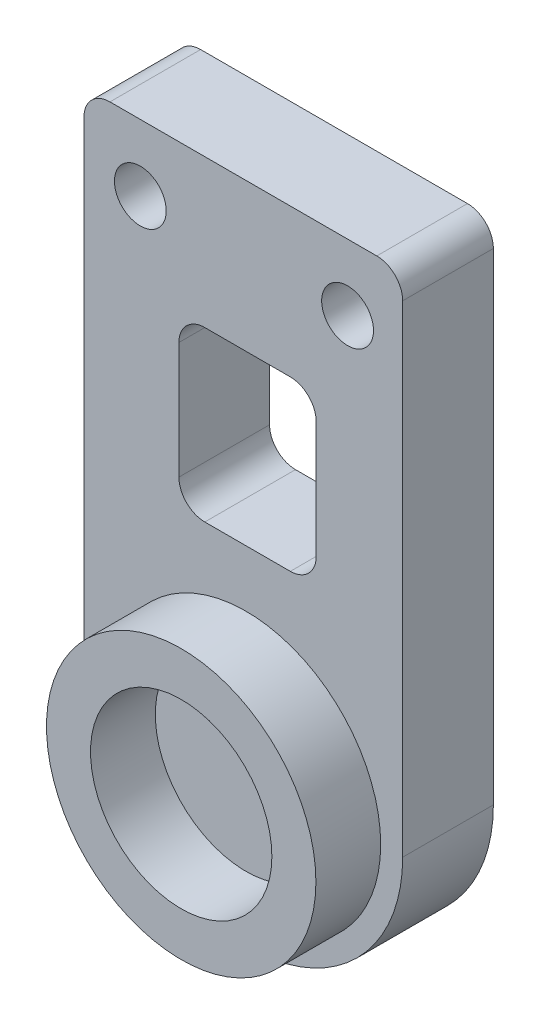
ISO-10303-21;
HEADER;
FILE_DESCRIPTION(('STEP AP214'),'2;1');
FILE_NAME('part.step','',(''),(''),'','','');
FILE_SCHEMA(('AUTOMOTIVE_DESIGN { 1 0 10303 214 1 1 1 1 }'));
ENDSEC;
DATA;
#1=APPLICATION_CONTEXT('core data for automotive mechanical design processes');
#2=APPLICATION_PROTOCOL_DEFINITION('international standard','automotive_design',2000,#1);
#3=PRODUCT_CONTEXT('',#1,'mechanical');
#4=PRODUCT('Part','Part','',(#3));
#5=PRODUCT_RELATED_PRODUCT_CATEGORY('part','',(#4));
#6=PRODUCT_DEFINITION_FORMATION('','',#4);
#7=PRODUCT_DEFINITION_CONTEXT('part definition',#1,'design');
#8=PRODUCT_DEFINITION('design','',#6,#7);
#9=PRODUCT_DEFINITION_SHAPE('','',#8);
#10=(LENGTH_UNIT() NAMED_UNIT(*) SI_UNIT(.MILLI.,.METRE.));
#11=(NAMED_UNIT(*) PLANE_ANGLE_UNIT() SI_UNIT($,.RADIAN.));
#12=(NAMED_UNIT(*) SI_UNIT($,.STERADIAN.) SOLID_ANGLE_UNIT());
#13=UNCERTAINTY_MEASURE_WITH_UNIT(LENGTH_MEASURE(1.E-05),#10,'distance_accuracy_value','');
#14=(GEOMETRIC_REPRESENTATION_CONTEXT(3) GLOBAL_UNCERTAINTY_ASSIGNED_CONTEXT((#13)) GLOBAL_UNIT_ASSIGNED_CONTEXT((#10,
#11,#12)) REPRESENTATION_CONTEXT('',''));
#15=CARTESIAN_POINT('',(0.,0.,0.));
#16=DIRECTION('',(0.,0.,1.));
#17=DIRECTION('',(1.,0.,0.));
#18=AXIS2_PLACEMENT_3D('',#15,#16,#17);
#19=CARTESIAN_POINT('',(-301.254618969033,240.505749953129,11.5));
#20=DIRECTION('',(1.,0.,0.));
#21=DIRECTION('',(0.,0.,-1.));
#22=AXIS2_PLACEMENT_3D('',#19,#20,#21);
#23=PLANE('',#22);
#24=DIRECTION('',(0.,-1.,0.));
#25=VECTOR('',#24,1.);
#26=CARTESIAN_POINT('',(-301.254618969033,240.505749953129,8.));
#27=LINE('',#26,#25);
#28=CARTESIAN_POINT('',(-301.254618969033,239.505749953129,8.));
#29=VERTEX_POINT('',#28);
#30=CARTESIAN_POINT('',(-301.254618969033,220.905749953129,8.));
#31=VERTEX_POINT('',#30);
#32=EDGE_CURVE('E201',#29,#31,#27,.T.);
#33=ORIENTED_EDGE('',*,*,#32,.T.);
#34=DIRECTION('',(0.,0.,-1.));
#35=VECTOR('',#34,1.);
#36=CARTESIAN_POINT('',(-301.254618969033,220.905749953129,11.5));
#37=LINE('',#36,#35);
#38=CARTESIAN_POINT('',(-301.254618969033,220.905749953129,11.5));
#39=VERTEX_POINT('',#38);
#40=EDGE_CURVE('E44',#31,#39,#37,.F.);
#41=ORIENTED_EDGE('',*,*,#40,.T.);
#42=DIRECTION('',(0.,-1.,0.));
#43=VECTOR('',#42,1.);
#44=CARTESIAN_POINT('',(-301.254618969033,240.505749953129,11.5));
#45=LINE('',#44,#43);
#46=CARTESIAN_POINT('',(-301.254618969033,239.505749953129,11.5));
#47=VERTEX_POINT('',#46);
#48=EDGE_CURVE('E191',#47,#39,#45,.T.);
#49=ORIENTED_EDGE('',*,*,#48,.F.);
#50=DIRECTION('',(0.,0.,-1.));
#51=VECTOR('',#50,1.);
#52=CARTESIAN_POINT('',(-301.254618969033,239.505749953129,11.5));
#53=LINE('',#52,#51);
#54=EDGE_CURVE('E224',#47,#29,#53,.T.);
#55=ORIENTED_EDGE('',*,*,#54,.T.);
#56=EDGE_LOOP('',(#33,#41,#49,#55));
#57=FACE_BOUND('',#56,.T.);
#58=ADVANCED_FACE('F36',(#57),#23,.F.);
#59=CARTESIAN_POINT('',(-301.254618969033,214.905749953129,11.5));
#60=DIRECTION('',(0.,1.,0.));
#61=DIRECTION('',(0.,0.,1.));
#62=AXIS2_PLACEMENT_3D('',#59,#60,#61);
#63=PLANE('',#62);
#64=DIRECTION('',(1.,0.,0.));
#65=VECTOR('',#64,1.);
#66=CARTESIAN_POINT('',(-301.254618969033,214.905749953129,8.));
#67=LINE('',#66,#65);
#68=CARTESIAN_POINT('',(-295.254618969033,214.905749953129,8.));
#69=VERTEX_POINT('',#68);
#70=CARTESIAN_POINT('',(-294.954618969033,214.905749953129,8.));
#71=VERTEX_POINT('',#70);
#72=EDGE_CURVE('E203',#69,#71,#67,.T.);
#73=ORIENTED_EDGE('',*,*,#72,.T.);
#74=DIRECTION('',(0.,0.,-1.));
#75=VECTOR('',#74,1.);
#76=CARTESIAN_POINT('',(-294.954618969033,214.905749953129,11.5));
#77=LINE('',#76,#75);
#78=CARTESIAN_POINT('',(-294.954618969033,214.905749953129,11.5));
#79=VERTEX_POINT('',#78);
#80=EDGE_CURVE('E58',#71,#79,#77,.F.);
#81=ORIENTED_EDGE('',*,*,#80,.T.);
#82=DIRECTION('',(1.,0.,0.));
#83=VECTOR('',#82,1.);
#84=CARTESIAN_POINT('',(-301.254618969033,214.905749953129,11.5));
#85=LINE('',#84,#83);
#86=CARTESIAN_POINT('',(-295.254618969033,214.905749953129,11.5));
#87=VERTEX_POINT('',#86);
#88=EDGE_CURVE('E193',#87,#79,#85,.T.);
#89=ORIENTED_EDGE('',*,*,#88,.F.);
#90=DIRECTION('',(0.,0.,-1.));
#91=VECTOR('',#90,1.);
#92=CARTESIAN_POINT('',(-295.254618969033,214.905749953129,11.5));
#93=LINE('',#92,#91);
#94=EDGE_CURVE('E262',#87,#69,#93,.T.);
#95=ORIENTED_EDGE('',*,*,#94,.T.);
#96=EDGE_LOOP('',(#73,#81,#89,#95));
#97=FACE_BOUND('',#96,.T.);
#98=ADVANCED_FACE('F282',(#97),#63,.F.);
#99=CARTESIAN_POINT('',(-288.954618969033,240.505749953129,11.5));
#100=DIRECTION('',(-1.,0.,0.));
#101=DIRECTION('',(0.,-1.,0.));
#102=AXIS2_PLACEMENT_3D('',#99,#100,#101);
#103=PLANE('',#102);
#104=DIRECTION('',(0.,1.,0.));
#105=VECTOR('',#104,1.);
#106=CARTESIAN_POINT('',(-288.954618969033,240.505749953129,11.5));
#107=LINE('',#106,#105);
#108=CARTESIAN_POINT('',(-288.954618969033,220.905749953129,11.5));
#109=VERTEX_POINT('',#108);
#110=CARTESIAN_POINT('',(-288.954618969033,239.505749953129,11.5));
#111=VERTEX_POINT('',#110);
#112=EDGE_CURVE('E196',#109,#111,#107,.T.);
#113=ORIENTED_EDGE('',*,*,#112,.F.);
#114=DIRECTION('',(0.,0.,-1.));
#115=VECTOR('',#114,1.);
#116=CARTESIAN_POINT('',(-288.954618969033,220.905749953129,11.5));
#117=LINE('',#116,#115);
#118=CARTESIAN_POINT('',(-288.954618969033,220.905749953129,8.));
#119=VERTEX_POINT('',#118);
#120=EDGE_CURVE('E255',#109,#119,#117,.T.);
#121=ORIENTED_EDGE('',*,*,#120,.T.);
#122=DIRECTION('',(0.,1.,0.));
#123=VECTOR('',#122,1.);
#124=CARTESIAN_POINT('',(-288.954618969033,240.505749953129,8.));
#125=LINE('',#124,#123);
#126=CARTESIAN_POINT('',(-288.954618969033,239.505749953129,8.));
#127=VERTEX_POINT('',#126);
#128=EDGE_CURVE('E206',#119,#127,#125,.T.);
#129=ORIENTED_EDGE('',*,*,#128,.T.);
#130=DIRECTION('',(0.,0.,-1.));
#131=VECTOR('',#130,1.);
#132=CARTESIAN_POINT('',(-288.954618969033,239.505749953129,11.5));
#133=LINE('',#132,#131);
#134=EDGE_CURVE('E163',#127,#111,#133,.F.);
#135=ORIENTED_EDGE('',*,*,#134,.T.);
#136=EDGE_LOOP('',(#113,#121,#129,#135));
#137=FACE_BOUND('',#136,.T.);
#138=ADVANCED_FACE('F274',(#137),#103,.F.);
#139=CARTESIAN_POINT('',(-301.254618969033,240.505749953129,11.5));
#140=DIRECTION('',(0.,-1.,0.));
#141=DIRECTION('',(0.,0.,-1.));
#142=AXIS2_PLACEMENT_3D('',#139,#140,#141);
#143=PLANE('',#142);
#144=DIRECTION('',(-1.,0.,0.));
#145=VECTOR('',#144,1.);
#146=CARTESIAN_POINT('',(-301.254618969033,240.505749953129,8.));
#147=LINE('',#146,#145);
#148=CARTESIAN_POINT('',(-289.954618969033,240.505749953129,8.));
#149=VERTEX_POINT('',#148);
#150=CARTESIAN_POINT('',(-300.254618969033,240.505749953129,8.));
#151=VERTEX_POINT('',#150);
#152=EDGE_CURVE('E194',#149,#151,#147,.T.);
#153=ORIENTED_EDGE('',*,*,#152,.T.);
#154=DIRECTION('',(0.,0.,-1.));
#155=VECTOR('',#154,1.);
#156=CARTESIAN_POINT('',(-300.254618969033,240.505749953129,11.5));
#157=LINE('',#156,#155);
#158=CARTESIAN_POINT('',(-300.254618969033,240.505749953129,11.5));
#159=VERTEX_POINT('',#158);
#160=EDGE_CURVE('E235',#151,#159,#157,.F.);
#161=ORIENTED_EDGE('',*,*,#160,.T.);
#162=DIRECTION('',(-1.,0.,0.));
#163=VECTOR('',#162,1.);
#164=CARTESIAN_POINT('',(-301.254618969033,240.505749953129,11.5));
#165=LINE('',#164,#163);
#166=CARTESIAN_POINT('',(-289.954618969033,240.505749953129,11.5));
#167=VERTEX_POINT('',#166);
#168=EDGE_CURVE('E198',#167,#159,#165,.T.);
#169=ORIENTED_EDGE('',*,*,#168,.F.);
#170=DIRECTION('',(0.,0.,-1.));
#171=VECTOR('',#170,1.);
#172=CARTESIAN_POINT('',(-289.954618969033,240.505749953129,11.5));
#173=LINE('',#172,#171);
#174=EDGE_CURVE('E232',#167,#149,#173,.T.);
#175=ORIENTED_EDGE('',*,*,#174,.T.);
#176=EDGE_LOOP('',(#153,#161,#169,#175));
#177=FACE_BOUND('',#176,.T.);
#178=ADVANCED_FACE('F294',(#177),#143,.F.);
#179=CARTESIAN_POINT('',(0.,0.,11.5));
#180=DIRECTION('',(0.,0.,1.));
#181=DIRECTION('',(1.,0.,0.));
#182=AXIS2_PLACEMENT_3D('',#179,#180,#181);
#183=PLANE('',#182);
#184=CARTESIAN_POINT('',(-295.004474020561,220.905749953129,11.5));
#185=DIRECTION('',(0.,0.,1.));
#186=DIRECTION('',(1.,0.,0.));
#187=AXIS2_PLACEMENT_3D('',#184,#185,#186);
#188=CIRCLE('',#187,5.19999999999997);
#189=CARTESIAN_POINT('',(-289.804474020561,220.905749953129,11.5));
#190=VERTEX_POINT('',#189);
#191=EDGE_CURVE('E353',#190,#190,#188,.T.);
#192=ORIENTED_EDGE('',*,*,#191,.F.);
#193=EDGE_LOOP('',(#192));
#194=FACE_BOUND('',#193,.T.);
#195=CARTESIAN_POINT('',(-299.082028178935,237.944260963885,11.5));
#196=DIRECTION('',(0.,0.,1.));
#197=DIRECTION('',(1.,0.,0.));
#198=AXIS2_PLACEMENT_3D('',#195,#196,#197);
#199=CIRCLE('',#198,0.999999999999998);
#200=CARTESIAN_POINT('',(-298.082028178935,237.944260963885,11.5));
#201=VERTEX_POINT('',#200);
#202=EDGE_CURVE('E364',#201,#201,#199,.T.);
#203=ORIENTED_EDGE('',*,*,#202,.F.);
#204=EDGE_LOOP('',(#203));
#205=FACE_BOUND('',#204,.T.);
#206=CARTESIAN_POINT('',(-291.082028178935,237.944260963885,11.5));
#207=DIRECTION('',(0.,0.,1.));
#208=DIRECTION('',(1.,0.,0.));
#209=AXIS2_PLACEMENT_3D('',#206,#207,#208);
#210=CIRCLE('',#209,0.999999999999998);
#211=CARTESIAN_POINT('',(-290.082028178935,237.944260963885,11.5));
#212=VERTEX_POINT('',#211);
#213=EDGE_CURVE('E340',#212,#212,#210,.T.);
#214=ORIENTED_EDGE('',*,*,#213,.F.);
#215=EDGE_LOOP('',(#214));
#216=FACE_BOUND('',#215,.T.);
#217=DIRECTION('',(0.,-1.,0.));
#218=VECTOR('',#217,1.);
#219=CARTESIAN_POINT('',(-297.592907714844,234.792892456055,11.5));
#220=LINE('',#219,#218);
#221=CARTESIAN_POINT('',(-297.592907714844,233.792892456055,11.5));
#222=VERTEX_POINT('',#221);
#223=CARTESIAN_POINT('',(-297.592907714844,229.292892456055,11.5));
#224=VERTEX_POINT('',#223);
#225=EDGE_CURVE('E187',#222,#224,#220,.T.);
#226=ORIENTED_EDGE('',*,*,#225,.F.);
#227=CARTESIAN_POINT('',(-296.592907714844,233.792892456055,11.5));
#228=DIRECTION('',(0.,0.,1.));
#229=DIRECTION('',(1.,0.,0.));
#230=AXIS2_PLACEMENT_3D('',#227,#228,#229);
#231=CIRCLE('',#230,1.);
#232=CARTESIAN_POINT('',(-296.592907714844,234.792892456055,11.5));
#233=VERTEX_POINT('',#232);
#234=EDGE_CURVE('E248',#222,#233,#231,.F.);
#235=ORIENTED_EDGE('',*,*,#234,.T.);
#236=DIRECTION('',(-1.,0.,0.));
#237=VECTOR('',#236,1.);
#238=CARTESIAN_POINT('',(-297.592907714844,234.792892456055,11.5));
#239=LINE('',#238,#237);
#240=CARTESIAN_POINT('',(-293.292907714844,234.792892456055,11.5));
#241=VERTEX_POINT('',#240);
#242=EDGE_CURVE('E181',#241,#233,#239,.T.);
#243=ORIENTED_EDGE('',*,*,#242,.F.);
#244=CARTESIAN_POINT('',(-293.292907714844,233.792892456055,11.5));
#245=DIRECTION('',(0.,0.,1.));
#246=DIRECTION('',(1.,0.,0.));
#247=AXIS2_PLACEMENT_3D('',#244,#245,#246);
#248=CIRCLE('',#247,1.);
#249=CARTESIAN_POINT('',(-292.292907714844,233.792892456055,11.5));
#250=VERTEX_POINT('',#249);
#251=EDGE_CURVE('E180',#241,#250,#248,.F.);
#252=ORIENTED_EDGE('',*,*,#251,.T.);
#253=DIRECTION('',(0.,1.,0.));
#254=VECTOR('',#253,1.);
#255=CARTESIAN_POINT('',(-292.292907714844,234.792892456055,11.5));
#256=LINE('',#255,#254);
#257=CARTESIAN_POINT('',(-292.292907714844,229.292892456055,11.5));
#258=VERTEX_POINT('',#257);
#259=EDGE_CURVE('E169',#258,#250,#256,.T.);
#260=ORIENTED_EDGE('',*,*,#259,.F.);
#261=CARTESIAN_POINT('',(-293.292907714844,229.292892456055,11.5));
#262=DIRECTION('',(0.,0.,1.));
#263=DIRECTION('',(1.,0.,0.));
#264=AXIS2_PLACEMENT_3D('',#261,#262,#263);
#265=CIRCLE('',#264,1.);
#266=CARTESIAN_POINT('',(-293.292907714844,228.292892456055,11.5));
#267=VERTEX_POINT('',#266);
#268=EDGE_CURVE('E152',#258,#267,#265,.F.);
#269=ORIENTED_EDGE('',*,*,#268,.T.);
#270=DIRECTION('',(1.,0.,0.));
#271=VECTOR('',#270,1.);
#272=CARTESIAN_POINT('',(-297.592907714844,228.292892456055,11.5));
#273=LINE('',#272,#271);
#274=CARTESIAN_POINT('',(-296.592907714844,228.292892456055,11.5));
#275=VERTEX_POINT('',#274);
#276=EDGE_CURVE('E182',#275,#267,#273,.T.);
#277=ORIENTED_EDGE('',*,*,#276,.F.);
#278=CARTESIAN_POINT('',(-296.592907714844,229.292892456055,11.5));
#279=DIRECTION('',(0.,0.,1.));
#280=DIRECTION('',(1.,0.,0.));
#281=AXIS2_PLACEMENT_3D('',#278,#279,#280);
#282=CIRCLE('',#281,1.);
#283=EDGE_CURVE('E244',#275,#224,#282,.F.);
#284=ORIENTED_EDGE('',*,*,#283,.T.);
#285=EDGE_LOOP('',(#226,#235,#243,#252,#260,#269,#277,#284));
#286=FACE_BOUND('',#285,.T.);
#287=ORIENTED_EDGE('',*,*,#88,.T.);
#288=CARTESIAN_POINT('',(-294.954618969033,220.905749953129,11.5));
#289=DIRECTION('',(0.,0.,1.));
#290=DIRECTION('',(1.,0.,0.));
#291=AXIS2_PLACEMENT_3D('',#288,#289,#290);
#292=CIRCLE('',#291,6.);
#293=EDGE_CURVE('E268',#79,#109,#292,.T.);
#294=ORIENTED_EDGE('',*,*,#293,.T.);
#295=ORIENTED_EDGE('',*,*,#112,.T.);
#296=CARTESIAN_POINT('',(-289.954618969033,239.505749953129,11.5));
#297=DIRECTION('',(0.,0.,1.));
#298=DIRECTION('',(1.,0.,0.));
#299=AXIS2_PLACEMENT_3D('',#296,#297,#298);
#300=CIRCLE('',#299,1.);
#301=EDGE_CURVE('E237',#111,#167,#300,.T.);
#302=ORIENTED_EDGE('',*,*,#301,.T.);
#303=ORIENTED_EDGE('',*,*,#168,.T.);
#304=CARTESIAN_POINT('',(-300.254618969033,239.505749953129,11.5));
#305=DIRECTION('',(0.,0.,1.));
#306=DIRECTION('',(1.,0.,0.));
#307=AXIS2_PLACEMENT_3D('',#304,#305,#306);
#308=CIRCLE('',#307,1.);
#309=EDGE_CURVE('E239',#159,#47,#308,.T.);
#310=ORIENTED_EDGE('',*,*,#309,.T.);
#311=ORIENTED_EDGE('',*,*,#48,.T.);
#312=CARTESIAN_POINT('',(-295.254618969033,220.905749953129,11.5));
#313=DIRECTION('',(0.,0.,1.));
#314=DIRECTION('',(1.,0.,0.));
#315=AXIS2_PLACEMENT_3D('',#312,#313,#314);
#316=CIRCLE('',#315,6.);
#317=EDGE_CURVE('E266',#39,#87,#316,.T.);
#318=ORIENTED_EDGE('',*,*,#317,.T.);
#319=EDGE_LOOP('',(#287,#294,#295,#302,#303,#310,#311,#318));
#320=FACE_BOUND('',#319,.T.);
#321=ADVANCED_FACE('F177',(#194,#205,#216,#286,#320),#183,.T.);
#322=CARTESIAN_POINT('',(0.,0.,8.));
#323=DIRECTION('',(0.,0.,1.));
#324=DIRECTION('',(1.,0.,0.));
#325=AXIS2_PLACEMENT_3D('',#322,#323,#324);
#326=PLANE('',#325);
#327=CARTESIAN_POINT('',(-299.082028178935,237.944260963885,8.));
#328=DIRECTION('',(0.,0.,1.));
#329=DIRECTION('',(1.,0.,0.));
#330=AXIS2_PLACEMENT_3D('',#327,#328,#329);
#331=CIRCLE('',#330,0.999999999999998);
#332=CARTESIAN_POINT('',(-298.082028178935,237.944260963885,8.));
#333=VERTEX_POINT('',#332);
#334=EDGE_CURVE('E204',#333,#333,#331,.T.);
#335=ORIENTED_EDGE('',*,*,#334,.T.);
#336=EDGE_LOOP('',(#335));
#337=FACE_BOUND('',#336,.T.);
#338=CARTESIAN_POINT('',(-291.082028178935,237.944260963885,8.));
#339=DIRECTION('',(0.,0.,1.));
#340=DIRECTION('',(1.,0.,0.));
#341=AXIS2_PLACEMENT_3D('',#338,#339,#340);
#342=CIRCLE('',#341,0.999999999999998);
#343=CARTESIAN_POINT('',(-290.082028178935,237.944260963885,8.));
#344=VERTEX_POINT('',#343);
#345=EDGE_CURVE('E343',#344,#344,#342,.T.);
#346=ORIENTED_EDGE('',*,*,#345,.T.);
#347=EDGE_LOOP('',(#346));
#348=FACE_BOUND('',#347,.T.);
#349=DIRECTION('',(0.,1.,0.));
#350=VECTOR('',#349,1.);
#351=CARTESIAN_POINT('',(-292.292907714844,234.792892456055,8.));
#352=LINE('',#351,#350);
#353=CARTESIAN_POINT('',(-292.292907714844,229.292892456055,8.));
#354=VERTEX_POINT('',#353);
#355=CARTESIAN_POINT('',(-292.292907714844,233.792892456055,8.));
#356=VERTEX_POINT('',#355);
#357=EDGE_CURVE('E172',#354,#356,#352,.T.);
#358=ORIENTED_EDGE('',*,*,#357,.T.);
#359=CARTESIAN_POINT('',(-293.292907714844,233.792892456055,8.));
#360=DIRECTION('',(0.,0.,1.));
#361=DIRECTION('',(1.,0.,0.));
#362=AXIS2_PLACEMENT_3D('',#359,#360,#361);
#363=CIRCLE('',#362,1.);
#364=CARTESIAN_POINT('',(-293.292907714844,234.792892456055,8.));
#365=VERTEX_POINT('',#364);
#366=EDGE_CURVE('E253',#356,#365,#363,.T.);
#367=ORIENTED_EDGE('',*,*,#366,.T.);
#368=DIRECTION('',(-1.,0.,0.));
#369=VECTOR('',#368,1.);
#370=CARTESIAN_POINT('',(-297.592907714844,234.792892456055,8.));
#371=LINE('',#370,#369);
#372=CARTESIAN_POINT('',(-296.592907714844,234.792892456055,8.));
#373=VERTEX_POINT('',#372);
#374=EDGE_CURVE('E335',#365,#373,#371,.T.);
#375=ORIENTED_EDGE('',*,*,#374,.T.);
#376=CARTESIAN_POINT('',(-296.592907714844,233.792892456055,8.));
#377=DIRECTION('',(0.,0.,1.));
#378=DIRECTION('',(1.,0.,0.));
#379=AXIS2_PLACEMENT_3D('',#376,#377,#378);
#380=CIRCLE('',#379,1.);
#381=CARTESIAN_POINT('',(-297.592907714844,233.792892456055,8.));
#382=VERTEX_POINT('',#381);
#383=EDGE_CURVE('E250',#373,#382,#380,.T.);
#384=ORIENTED_EDGE('',*,*,#383,.T.);
#385=DIRECTION('',(0.,-1.,0.));
#386=VECTOR('',#385,1.);
#387=CARTESIAN_POINT('',(-297.592907714844,234.792892456055,8.));
#388=LINE('',#387,#386);
#389=CARTESIAN_POINT('',(-297.592907714844,229.292892456055,8.));
#390=VERTEX_POINT('',#389);
#391=EDGE_CURVE('E185',#382,#390,#388,.T.);
#392=ORIENTED_EDGE('',*,*,#391,.T.);
#393=CARTESIAN_POINT('',(-296.592907714844,229.292892456055,8.));
#394=DIRECTION('',(0.,0.,1.));
#395=DIRECTION('',(1.,0.,0.));
#396=AXIS2_PLACEMENT_3D('',#393,#394,#395);
#397=CIRCLE('',#396,1.);
#398=CARTESIAN_POINT('',(-296.592907714844,228.292892456055,8.));
#399=VERTEX_POINT('',#398);
#400=EDGE_CURVE('E246',#390,#399,#397,.T.);
#401=ORIENTED_EDGE('',*,*,#400,.T.);
#402=DIRECTION('',(1.,0.,0.));
#403=VECTOR('',#402,1.);
#404=CARTESIAN_POINT('',(-297.592907714844,228.292892456055,8.));
#405=LINE('',#404,#403);
#406=CARTESIAN_POINT('',(-293.292907714844,228.292892456055,8.));
#407=VERTEX_POINT('',#406);
#408=EDGE_CURVE('E345',#399,#407,#405,.T.);
#409=ORIENTED_EDGE('',*,*,#408,.T.);
#410=CARTESIAN_POINT('',(-293.292907714844,229.292892456055,8.));
#411=DIRECTION('',(0.,0.,1.));
#412=DIRECTION('',(1.,0.,0.));
#413=AXIS2_PLACEMENT_3D('',#410,#411,#412);
#414=CIRCLE('',#413,1.);
#415=EDGE_CURVE('E162',#407,#354,#414,.T.);
#416=ORIENTED_EDGE('',*,*,#415,.T.);
#417=EDGE_LOOP('',(#358,#367,#375,#384,#392,#401,#409,#416));
#418=FACE_BOUND('',#417,.T.);
#419=ORIENTED_EDGE('',*,*,#128,.F.);
#420=CARTESIAN_POINT('',(-294.954618969033,220.905749953129,8.));
#421=DIRECTION('',(0.,0.,1.));
#422=DIRECTION('',(1.,0.,0.));
#423=AXIS2_PLACEMENT_3D('',#420,#421,#422);
#424=CIRCLE('',#423,6.);
#425=EDGE_CURVE('E260',#119,#71,#424,.F.);
#426=ORIENTED_EDGE('',*,*,#425,.T.);
#427=ORIENTED_EDGE('',*,*,#72,.F.);
#428=CARTESIAN_POINT('',(-295.254618969033,220.905749953129,8.));
#429=DIRECTION('',(0.,0.,1.));
#430=DIRECTION('',(1.,0.,0.));
#431=AXIS2_PLACEMENT_3D('',#428,#429,#430);
#432=CIRCLE('',#431,6.);
#433=EDGE_CURVE('E258',#69,#31,#432,.F.);
#434=ORIENTED_EDGE('',*,*,#433,.T.);
#435=ORIENTED_EDGE('',*,*,#32,.F.);
#436=CARTESIAN_POINT('',(-300.254618969033,239.505749953129,8.));
#437=DIRECTION('',(0.,0.,1.));
#438=DIRECTION('',(1.,0.,0.));
#439=AXIS2_PLACEMENT_3D('',#436,#437,#438);
#440=CIRCLE('',#439,1.);
#441=EDGE_CURVE('E230',#29,#151,#440,.F.);
#442=ORIENTED_EDGE('',*,*,#441,.T.);
#443=ORIENTED_EDGE('',*,*,#152,.F.);
#444=CARTESIAN_POINT('',(-289.954618969033,239.505749953129,8.));
#445=DIRECTION('',(0.,0.,1.));
#446=DIRECTION('',(1.,0.,0.));
#447=AXIS2_PLACEMENT_3D('',#444,#445,#446);
#448=CIRCLE('',#447,1.);
#449=EDGE_CURVE('E227',#149,#127,#448,.F.);
#450=ORIENTED_EDGE('',*,*,#449,.T.);
#451=EDGE_LOOP('',(#419,#426,#427,#434,#435,#442,#443,#450));
#452=FACE_BOUND('',#451,.T.);
#453=ADVANCED_FACE('F281',(#337,#348,#418,#452),#326,.F.);
#454=CARTESIAN_POINT('',(-297.592907714844,234.792892456055,8.));
#455=DIRECTION('',(-1.,0.,0.));
#456=DIRECTION('',(0.,0.,1.));
#457=AXIS2_PLACEMENT_3D('',#454,#455,#456);
#458=PLANE('',#457);
#459=ORIENTED_EDGE('',*,*,#225,.T.);
#460=DIRECTION('',(0.,0.,1.));
#461=VECTOR('',#460,1.);
#462=CARTESIAN_POINT('',(-297.592907714844,229.292892456055,8.));
#463=LINE('',#462,#461);
#464=EDGE_CURVE('E217',#224,#390,#463,.F.);
#465=ORIENTED_EDGE('',*,*,#464,.T.);
#466=ORIENTED_EDGE('',*,*,#391,.F.);
#467=DIRECTION('',(0.,0.,1.));
#468=VECTOR('',#467,1.);
#469=CARTESIAN_POINT('',(-297.592907714844,233.792892456055,11.5));
#470=LINE('',#469,#468);
#471=EDGE_CURVE('E214',#382,#222,#470,.T.);
#472=ORIENTED_EDGE('',*,*,#471,.T.);
#473=EDGE_LOOP('',(#459,#465,#466,#472));
#474=FACE_BOUND('',#473,.T.);
#475=ADVANCED_FACE('F378',(#474),#458,.F.);
#476=CARTESIAN_POINT('',(-297.592907714844,234.792892456055,8.));
#477=DIRECTION('',(0.,1.,0.));
#478=DIRECTION('',(0.,0.,1.));
#479=AXIS2_PLACEMENT_3D('',#476,#477,#478);
#480=PLANE('',#479);
#481=ORIENTED_EDGE('',*,*,#242,.T.);
#482=DIRECTION('',(0.,0.,1.));
#483=VECTOR('',#482,1.);
#484=CARTESIAN_POINT('',(-296.592907714844,234.792892456055,8.));
#485=LINE('',#484,#483);
#486=EDGE_CURVE('E222',#233,#373,#485,.F.);
#487=ORIENTED_EDGE('',*,*,#486,.T.);
#488=ORIENTED_EDGE('',*,*,#374,.F.);
#489=DIRECTION('',(0.,0.,1.));
#490=VECTOR('',#489,1.);
#491=CARTESIAN_POINT('',(-293.292907714844,234.792892456055,11.5));
#492=LINE('',#491,#490);
#493=EDGE_CURVE('E219',#365,#241,#492,.T.);
#494=ORIENTED_EDGE('',*,*,#493,.T.);
#495=EDGE_LOOP('',(#481,#487,#488,#494));
#496=FACE_BOUND('',#495,.T.);
#497=ADVANCED_FACE('F338',(#496),#480,.F.);
#498=CARTESIAN_POINT('',(-292.292907714844,234.792892456055,8.));
#499=DIRECTION('',(1.,0.,0.));
#500=DIRECTION('',(0.,0.,-1.));
#501=AXIS2_PLACEMENT_3D('',#498,#499,#500);
#502=PLANE('',#501);
#503=ORIENTED_EDGE('',*,*,#357,.F.);
#504=DIRECTION('',(0.,0.,1.));
#505=VECTOR('',#504,1.);
#506=CARTESIAN_POINT('',(-292.292907714844,229.292892456055,11.5));
#507=LINE('',#506,#505);
#508=EDGE_CURVE('E156',#354,#258,#507,.T.);
#509=ORIENTED_EDGE('',*,*,#508,.T.);
#510=ORIENTED_EDGE('',*,*,#259,.T.);
#511=DIRECTION('',(0.,0.,1.));
#512=VECTOR('',#511,1.);
#513=CARTESIAN_POINT('',(-292.292907714844,233.792892456055,8.));
#514=LINE('',#513,#512);
#515=EDGE_CURVE('E174',#250,#356,#514,.F.);
#516=ORIENTED_EDGE('',*,*,#515,.T.);
#517=EDGE_LOOP('',(#503,#509,#510,#516));
#518=FACE_BOUND('',#517,.T.);
#519=ADVANCED_FACE('F168',(#518),#502,.F.);
#520=CARTESIAN_POINT('',(-297.592907714844,228.292892456055,8.));
#521=DIRECTION('',(0.,-1.,0.));
#522=DIRECTION('',(0.,0.,-1.));
#523=AXIS2_PLACEMENT_3D('',#520,#521,#522);
#524=PLANE('',#523);
#525=ORIENTED_EDGE('',*,*,#276,.T.);
#526=DIRECTION('',(0.,0.,1.));
#527=VECTOR('',#526,1.);
#528=CARTESIAN_POINT('',(-293.292907714844,228.292892456055,8.));
#529=LINE('',#528,#527);
#530=EDGE_CURVE('E157',#267,#407,#529,.F.);
#531=ORIENTED_EDGE('',*,*,#530,.T.);
#532=ORIENTED_EDGE('',*,*,#408,.F.);
#533=DIRECTION('',(0.,0.,1.));
#534=VECTOR('',#533,1.);
#535=CARTESIAN_POINT('',(-296.592907714844,228.292892456055,11.5));
#536=LINE('',#535,#534);
#537=EDGE_CURVE('E173',#399,#275,#536,.T.);
#538=ORIENTED_EDGE('',*,*,#537,.T.);
#539=EDGE_LOOP('',(#525,#531,#532,#538));
#540=FACE_BOUND('',#539,.T.);
#541=ADVANCED_FACE('F375',(#540),#524,.F.);
#542=CARTESIAN_POINT('',(-291.082028178935,237.944260963885,8.));
#543=DIRECTION('',(0.,0.,1.));
#544=DIRECTION('',(1.,0.,0.));
#545=AXIS2_PLACEMENT_3D('',#542,#543,#544);
#546=CYLINDRICAL_SURFACE('',#545,0.999999999999998);
#547=ORIENTED_EDGE('',*,*,#345,.F.);
#548=EDGE_LOOP('',(#547));
#549=FACE_BOUND('',#548,.T.);
#550=ORIENTED_EDGE('',*,*,#213,.T.);
#551=EDGE_LOOP('',(#550));
#552=FACE_BOUND('',#551,.T.);
#553=ADVANCED_FACE('F476',(#549,#552),#546,.F.);
#554=CARTESIAN_POINT('',(-299.082028178935,237.944260963885,8.));
#555=DIRECTION('',(0.,0.,1.));
#556=DIRECTION('',(1.,0.,0.));
#557=AXIS2_PLACEMENT_3D('',#554,#555,#556);
#558=CYLINDRICAL_SURFACE('',#557,0.999999999999998);
#559=ORIENTED_EDGE('',*,*,#334,.F.);
#560=EDGE_LOOP('',(#559));
#561=FACE_BOUND('',#560,.T.);
#562=ORIENTED_EDGE('',*,*,#202,.T.);
#563=EDGE_LOOP('',(#562));
#564=FACE_BOUND('',#563,.T.);
#565=ADVANCED_FACE('F318',(#561,#564),#558,.F.);
#566=CARTESIAN_POINT('',(-293.292907714844,229.292892456055,8.));
#567=DIRECTION('',(0.,0.,-1.));
#568=DIRECTION('',(-1.,0.,0.));
#569=AXIS2_PLACEMENT_3D('',#566,#567,#568);
#570=CYLINDRICAL_SURFACE('',#569,1.);
#571=ORIENTED_EDGE('',*,*,#415,.F.);
#572=ORIENTED_EDGE('',*,*,#530,.F.);
#573=ORIENTED_EDGE('',*,*,#268,.F.);
#574=ORIENTED_EDGE('',*,*,#508,.F.);
#575=EDGE_LOOP('',(#571,#572,#573,#574));
#576=FACE_BOUND('',#575,.T.);
#577=ADVANCED_FACE('F155',(#576),#570,.F.);
#578=CARTESIAN_POINT('',(-296.592907714844,229.292892456055,8.));
#579=DIRECTION('',(0.,0.,-1.));
#580=DIRECTION('',(-1.,0.,0.));
#581=AXIS2_PLACEMENT_3D('',#578,#579,#580);
#582=CYLINDRICAL_SURFACE('',#581,1.);
#583=ORIENTED_EDGE('',*,*,#400,.F.);
#584=ORIENTED_EDGE('',*,*,#464,.F.);
#585=ORIENTED_EDGE('',*,*,#283,.F.);
#586=ORIENTED_EDGE('',*,*,#537,.F.);
#587=EDGE_LOOP('',(#583,#584,#585,#586));
#588=FACE_BOUND('',#587,.T.);
#589=ADVANCED_FACE('F317',(#588),#582,.F.);
#590=CARTESIAN_POINT('',(-296.592907714844,233.792892456055,8.));
#591=DIRECTION('',(0.,0.,-1.));
#592=DIRECTION('',(-1.,0.,0.));
#593=AXIS2_PLACEMENT_3D('',#590,#591,#592);
#594=CYLINDRICAL_SURFACE('',#593,1.);
#595=ORIENTED_EDGE('',*,*,#383,.F.);
#596=ORIENTED_EDGE('',*,*,#486,.F.);
#597=ORIENTED_EDGE('',*,*,#234,.F.);
#598=ORIENTED_EDGE('',*,*,#471,.F.);
#599=EDGE_LOOP('',(#595,#596,#597,#598));
#600=FACE_BOUND('',#599,.T.);
#601=ADVANCED_FACE('F321',(#600),#594,.F.);
#602=CARTESIAN_POINT('',(-293.292907714844,233.792892456055,8.));
#603=DIRECTION('',(0.,0.,-1.));
#604=DIRECTION('',(-1.,0.,0.));
#605=AXIS2_PLACEMENT_3D('',#602,#603,#604);
#606=CYLINDRICAL_SURFACE('',#605,1.);
#607=ORIENTED_EDGE('',*,*,#366,.F.);
#608=ORIENTED_EDGE('',*,*,#515,.F.);
#609=ORIENTED_EDGE('',*,*,#251,.F.);
#610=ORIENTED_EDGE('',*,*,#493,.F.);
#611=EDGE_LOOP('',(#607,#608,#609,#610));
#612=FACE_BOUND('',#611,.T.);
#613=ADVANCED_FACE('F305',(#612),#606,.F.);
#614=CARTESIAN_POINT('',(-300.254618969033,239.505749953129,11.5));
#615=DIRECTION('',(0.,0.,-1.));
#616=DIRECTION('',(-1.,0.,0.));
#617=AXIS2_PLACEMENT_3D('',#614,#615,#616);
#618=CYLINDRICAL_SURFACE('',#617,1.);
#619=ORIENTED_EDGE('',*,*,#309,.F.);
#620=ORIENTED_EDGE('',*,*,#160,.F.);
#621=ORIENTED_EDGE('',*,*,#441,.F.);
#622=ORIENTED_EDGE('',*,*,#54,.F.);
#623=EDGE_LOOP('',(#619,#620,#621,#622));
#624=FACE_BOUND('',#623,.T.);
#625=ADVANCED_FACE('F290',(#624),#618,.T.);
#626=CARTESIAN_POINT('',(-289.954618969033,239.505749953129,11.5));
#627=DIRECTION('',(0.,0.,-1.));
#628=DIRECTION('',(-1.,0.,0.));
#629=AXIS2_PLACEMENT_3D('',#626,#627,#628);
#630=CYLINDRICAL_SURFACE('',#629,1.);
#631=ORIENTED_EDGE('',*,*,#301,.F.);
#632=ORIENTED_EDGE('',*,*,#134,.F.);
#633=ORIENTED_EDGE('',*,*,#449,.F.);
#634=ORIENTED_EDGE('',*,*,#174,.F.);
#635=EDGE_LOOP('',(#631,#632,#633,#634));
#636=FACE_BOUND('',#635,.T.);
#637=ADVANCED_FACE('F298',(#636),#630,.T.);
#638=CARTESIAN_POINT('',(-294.954618969033,220.905749953129,11.5));
#639=DIRECTION('',(0.,0.,-1.));
#640=DIRECTION('',(-1.,0.,0.));
#641=AXIS2_PLACEMENT_3D('',#638,#639,#640);
#642=CYLINDRICAL_SURFACE('',#641,6.);
#643=ORIENTED_EDGE('',*,*,#293,.F.);
#644=ORIENTED_EDGE('',*,*,#80,.F.);
#645=ORIENTED_EDGE('',*,*,#425,.F.);
#646=ORIENTED_EDGE('',*,*,#120,.F.);
#647=EDGE_LOOP('',(#643,#644,#645,#646));
#648=FACE_BOUND('',#647,.T.);
#649=ADVANCED_FACE('F278',(#648),#642,.T.);
#650=CARTESIAN_POINT('',(-295.254618969033,220.905749953129,11.5));
#651=DIRECTION('',(0.,0.,-1.));
#652=DIRECTION('',(-1.,0.,0.));
#653=AXIS2_PLACEMENT_3D('',#650,#651,#652);
#654=CYLINDRICAL_SURFACE('',#653,6.);
#655=ORIENTED_EDGE('',*,*,#317,.F.);
#656=ORIENTED_EDGE('',*,*,#40,.F.);
#657=ORIENTED_EDGE('',*,*,#433,.F.);
#658=ORIENTED_EDGE('',*,*,#94,.F.);
#659=EDGE_LOOP('',(#655,#656,#657,#658));
#660=FACE_BOUND('',#659,.T.);
#661=ADVANCED_FACE('F38',(#660),#654,.T.);
#662=CARTESIAN_POINT('',(-295.004474020561,220.905749953129,14.));
#663=DIRECTION('',(0.,0.,1.));
#664=DIRECTION('',(1.,0.,0.));
#665=AXIS2_PLACEMENT_3D('',#662,#663,#664);
#666=PLANE('',#665);
#667=CARTESIAN_POINT('',(-295.004474020561,220.905749953129,14.));
#668=DIRECTION('',(0.,0.,1.));
#669=DIRECTION('',(1.,0.,0.));
#670=AXIS2_PLACEMENT_3D('',#667,#668,#669);
#671=CIRCLE('',#670,5.19999999999997);
#672=CARTESIAN_POINT('',(-289.804474020561,220.905749953129,14.));
#673=VERTEX_POINT('',#672);
#674=EDGE_CURVE('E349',#673,#673,#671,.T.);
#675=ORIENTED_EDGE('',*,*,#674,.T.);
#676=EDGE_LOOP('',(#675));
#677=FACE_BOUND('',#676,.T.);
#678=CARTESIAN_POINT('',(-295.004474020561,220.905749953129,14.));
#679=DIRECTION('',(0.,0.,1.));
#680=DIRECTION('',(1.,0.,0.));
#681=AXIS2_PLACEMENT_3D('',#678,#679,#680);
#682=CIRCLE('',#681,3.50000000000002);
#683=CARTESIAN_POINT('',(-291.504474020561,220.905749953129,14.));
#684=VERTEX_POINT('',#683);
#685=EDGE_CURVE('E358',#684,#684,#682,.T.);
#686=ORIENTED_EDGE('',*,*,#685,.F.);
#687=EDGE_LOOP('',(#686));
#688=FACE_BOUND('',#687,.T.);
#689=ADVANCED_FACE('F431',(#677,#688),#666,.T.);
#690=CARTESIAN_POINT('',(-295.004474020561,220.905749953129,14.));
#691=DIRECTION('',(0.,0.,-1.));
#692=DIRECTION('',(-1.,0.,0.));
#693=AXIS2_PLACEMENT_3D('',#690,#691,#692);
#694=CYLINDRICAL_SURFACE('',#693,5.19999999999997);
#695=ORIENTED_EDGE('',*,*,#674,.F.);
#696=EDGE_LOOP('',(#695));
#697=FACE_BOUND('',#696,.T.);
#698=ORIENTED_EDGE('',*,*,#191,.T.);
#699=EDGE_LOOP('',(#698));
#700=FACE_BOUND('',#699,.T.);
#701=ADVANCED_FACE('F439',(#697,#700),#694,.T.);
#702=CARTESIAN_POINT('',(-295.004474020561,220.905749953129,14.));
#703=DIRECTION('',(0.,0.,-1.));
#704=DIRECTION('',(-1.,0.,0.));
#705=AXIS2_PLACEMENT_3D('',#702,#703,#704);
#706=CYLINDRICAL_SURFACE('',#705,3.50000000000002);
#707=ORIENTED_EDGE('',*,*,#685,.T.);
#708=EDGE_LOOP('',(#707));
#709=FACE_BOUND('',#708,.T.);
#710=CARTESIAN_POINT('',(-295.004474020561,220.905749953129,11.5));
#711=DIRECTION('',(0.,0.,1.));
#712=DIRECTION('',(1.,0.,0.));
#713=AXIS2_PLACEMENT_3D('',#710,#711,#712);
#714=CIRCLE('',#713,3.50000000000002);
#715=CARTESIAN_POINT('',(-291.504474020561,220.905749953129,11.5));
#716=VERTEX_POINT('',#715);
#717=EDGE_CURVE('E11',#716,#716,#714,.F.);
#718=ORIENTED_EDGE('',*,*,#717,.T.);
#719=EDGE_LOOP('',(#718));
#720=FACE_BOUND('',#719,.T.);
#721=ADVANCED_FACE('F446',(#709,#720),#706,.F.);
#722=ORIENTED_EDGE('',*,*,#717,.F.);
#723=EDGE_LOOP('',(#722));
#724=FACE_BOUND('',#723,.T.);
#725=ADVANCED_FACE('F393',(#724),#183,.T.);
#726=CLOSED_SHELL('',(#58,#98,#138,#178,#321,#453,#475,#497,#519,#541,#553,#565,#577,#589,#601,
#613,#625,#637,#649,#661,#689,#701,#721,#725));
#727=MANIFOLD_SOLID_BREP('B2',#726);
#728=ADVANCED_BREP_SHAPE_REPRESENTATION('',(#18,#727),#14);
#729=SHAPE_DEFINITION_REPRESENTATION(#9,#728);
ENDSEC;
END-ISO-10303-21;
